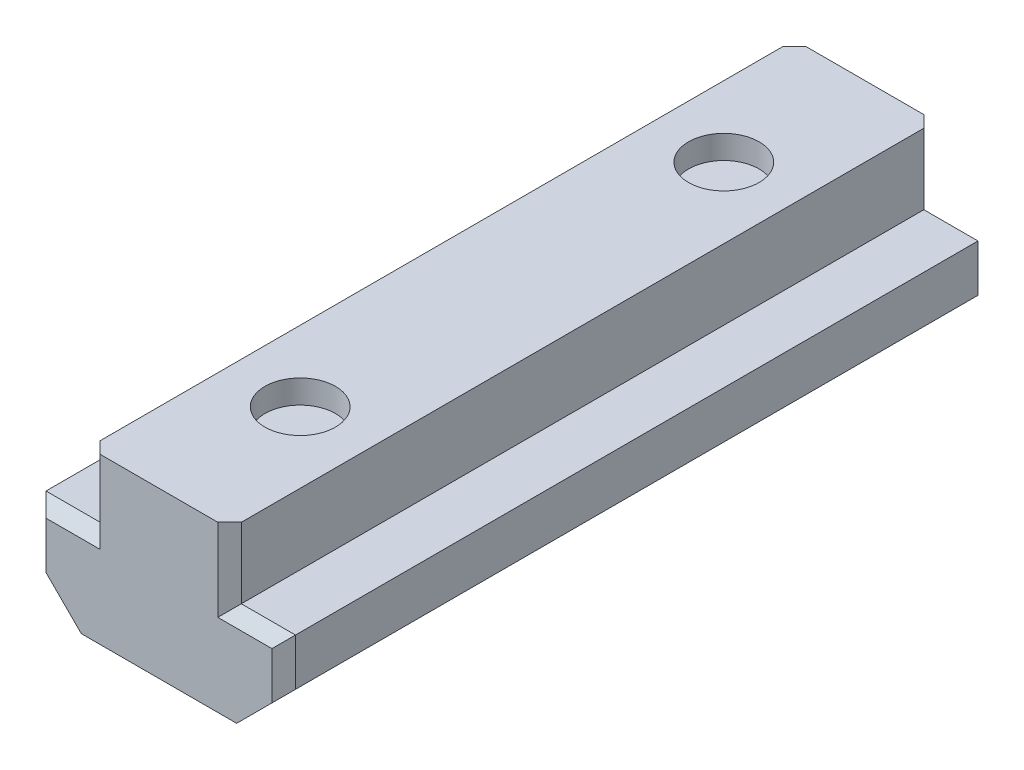
ISO-10303-21;
HEADER;
FILE_DESCRIPTION(('STEP AP214'),'2;1');
FILE_NAME('part.step','',(''),(''),'','','');
FILE_SCHEMA(('AUTOMOTIVE_DESIGN { 1 0 10303 214 1 1 1 1 }'));
ENDSEC;
DATA;
#1=APPLICATION_CONTEXT('core data for automotive mechanical design processes');
#2=APPLICATION_PROTOCOL_DEFINITION('international standard','automotive_design',2000,#1);
#3=PRODUCT_CONTEXT('',#1,'mechanical');
#4=PRODUCT('Part','Part','',(#3));
#5=PRODUCT_RELATED_PRODUCT_CATEGORY('part','',(#4));
#6=PRODUCT_DEFINITION_FORMATION('','',#4);
#7=PRODUCT_DEFINITION_CONTEXT('part definition',#1,'design');
#8=PRODUCT_DEFINITION('design','',#6,#7);
#9=PRODUCT_DEFINITION_SHAPE('','',#8);
#10=(LENGTH_UNIT() NAMED_UNIT(*) SI_UNIT(.MILLI.,.METRE.));
#11=(NAMED_UNIT(*) PLANE_ANGLE_UNIT() SI_UNIT($,.RADIAN.));
#12=(NAMED_UNIT(*) SI_UNIT($,.STERADIAN.) SOLID_ANGLE_UNIT());
#13=UNCERTAINTY_MEASURE_WITH_UNIT(LENGTH_MEASURE(1.E-05),#10,'distance_accuracy_value','');
#14=(GEOMETRIC_REPRESENTATION_CONTEXT(3) GLOBAL_UNCERTAINTY_ASSIGNED_CONTEXT((#13)) GLOBAL_UNIT_ASSIGNED_CONTEXT((#10,
#11,#12)) REPRESENTATION_CONTEXT('',''));
#15=CARTESIAN_POINT('',(0.,0.,0.));
#16=DIRECTION('',(0.,0.,1.));
#17=DIRECTION('',(1.,0.,0.));
#18=AXIS2_PLACEMENT_3D('',#15,#16,#17);
#19=CARTESIAN_POINT('',(-3.,0.,15.));
#20=DIRECTION('',(0.,-1.,0.));
#21=DIRECTION('',(0.,0.,-1.));
#22=AXIS2_PLACEMENT_3D('',#19,#20,#21);
#23=PLANE('',#22);
#24=CARTESIAN_POINT('',(0.,0.,-9.));
#25=DIRECTION('',(0.,1.,0.));
#26=DIRECTION('',(0.,0.,1.));
#27=AXIS2_PLACEMENT_3D('',#24,#25,#26);
#28=CIRCLE('',#27,1.5);
#29=CARTESIAN_POINT('',(0.,0.,-7.5));
#30=VERTEX_POINT('',#29);
#31=EDGE_CURVE('E385',#30,#30,#28,.T.);
#32=ORIENTED_EDGE('',*,*,#31,.F.);
#33=EDGE_LOOP('',(#32));
#34=FACE_BOUND('',#33,.T.);
#35=CARTESIAN_POINT('',(0.,0.,9.));
#36=DIRECTION('',(0.,1.,0.));
#37=DIRECTION('',(0.,0.,-1.));
#38=AXIS2_PLACEMENT_3D('',#35,#36,#37);
#39=CIRCLE('',#38,1.5);
#40=CARTESIAN_POINT('',(0.,0.,7.5));
#41=VERTEX_POINT('',#40);
#42=EDGE_CURVE('E382',#41,#41,#39,.T.);
#43=ORIENTED_EDGE('',*,*,#42,.F.);
#44=EDGE_LOOP('',(#43));
#45=FACE_BOUND('',#44,.T.);
#46=DIRECTION('',(-0.707106781186545,0.,0.70710678118655));
#47=VECTOR('',#46,1.);
#48=CARTESIAN_POINT('',(-2.5,0.,-15.));
#49=LINE('',#48,#47);
#50=CARTESIAN_POINT('',(-3.,0.,-14.5));
#51=VERTEX_POINT('',#50);
#52=CARTESIAN_POINT('',(-2.5,0.,-15.));
#53=VERTEX_POINT('',#52);
#54=EDGE_CURVE('E173',#51,#53,#49,.F.);
#55=ORIENTED_EDGE('',*,*,#54,.F.);
#56=DIRECTION('',(0.,0.,-1.));
#57=VECTOR('',#56,1.);
#58=CARTESIAN_POINT('',(-3.,0.,15.));
#59=LINE('',#58,#57);
#60=CARTESIAN_POINT('',(-3.,0.,14.5));
#61=VERTEX_POINT('',#60);
#62=EDGE_CURVE('E185',#61,#51,#59,.T.);
#63=ORIENTED_EDGE('',*,*,#62,.F.);
#64=DIRECTION('',(-0.707106781186545,0.,-0.70710678118655));
#65=VECTOR('',#64,1.);
#66=CARTESIAN_POINT('',(-2.5,0.,15.));
#67=LINE('',#66,#65);
#68=CARTESIAN_POINT('',(-2.5,0.,15.));
#69=VERTEX_POINT('',#68);
#70=EDGE_CURVE('E244',#61,#69,#67,.F.);
#71=ORIENTED_EDGE('',*,*,#70,.T.);
#72=DIRECTION('',(-1.,0.,0.));
#73=VECTOR('',#72,1.);
#74=CARTESIAN_POINT('',(-3.,0.,15.));
#75=LINE('',#74,#73);
#76=CARTESIAN_POINT('',(2.5,0.,15.));
#77=VERTEX_POINT('',#76);
#78=EDGE_CURVE('E278',#77,#69,#75,.T.);
#79=ORIENTED_EDGE('',*,*,#78,.F.);
#80=DIRECTION('',(-0.707106781186545,0.,0.70710678118655));
#81=VECTOR('',#80,1.);
#82=CARTESIAN_POINT('',(2.5,0.,15.));
#83=LINE('',#82,#81);
#84=CARTESIAN_POINT('',(3.,0.,14.5));
#85=VERTEX_POINT('',#84);
#86=EDGE_CURVE('E242',#77,#85,#83,.F.);
#87=ORIENTED_EDGE('',*,*,#86,.T.);
#88=DIRECTION('',(0.,0.,-1.));
#89=VECTOR('',#88,1.);
#90=CARTESIAN_POINT('',(3.,0.,15.));
#91=LINE('',#90,#89);
#92=CARTESIAN_POINT('',(3.,0.,-14.5));
#93=VERTEX_POINT('',#92);
#94=EDGE_CURVE('E195',#85,#93,#91,.T.);
#95=ORIENTED_EDGE('',*,*,#94,.T.);
#96=DIRECTION('',(-0.707106781186545,0.,-0.70710678118655));
#97=VECTOR('',#96,1.);
#98=CARTESIAN_POINT('',(2.5,0.,-15.));
#99=LINE('',#98,#97);
#100=CARTESIAN_POINT('',(2.5,0.,-15.));
#101=VERTEX_POINT('',#100);
#102=EDGE_CURVE('E332',#101,#93,#99,.F.);
#103=ORIENTED_EDGE('',*,*,#102,.F.);
#104=DIRECTION('',(-1.,0.,0.));
#105=VECTOR('',#104,1.);
#106=CARTESIAN_POINT('',(-3.,0.,-15.));
#107=LINE('',#106,#105);
#108=EDGE_CURVE('E189',#101,#53,#107,.T.);
#109=ORIENTED_EDGE('',*,*,#108,.T.);
#110=EDGE_LOOP('',(#55,#63,#71,#79,#87,#95,#103,#109));
#111=FACE_BOUND('',#110,.T.);
#112=ADVANCED_FACE('F43',(#34,#45,#111),#23,.F.);
#113=CARTESIAN_POINT('',(0.,0.,-15.));
#114=DIRECTION('',(0.,0.,-1.));
#115=DIRECTION('',(-1.,0.,0.));
#116=AXIS2_PLACEMENT_3D('',#113,#114,#115);
#117=PLANE('',#116);
#118=DIRECTION('',(0.707106781186546,-0.707106781186549,0.));
#119=VECTOR('',#118,1.);
#120=CARTESIAN_POINT('',(-5.15000000000001,-5.14999999999999,-15.));
#121=LINE('',#120,#119);
#122=CARTESIAN_POINT('',(-3.30000000000001,-7.,-15.));
#123=VERTEX_POINT('',#122);
#124=CARTESIAN_POINT('',(-4.80000000000001,-5.49999999999999,-15.));
#125=VERTEX_POINT('',#124);
#126=EDGE_CURVE('E210',#123,#125,#121,.F.);
#127=ORIENTED_EDGE('',*,*,#126,.T.);
#128=DIRECTION('',(0.,-1.,0.));
#129=VECTOR('',#128,1.);
#130=CARTESIAN_POINT('',(-4.8,0.,-15.));
#131=LINE('',#130,#129);
#132=CARTESIAN_POINT('',(-4.8,-3.5,-15.));
#133=VERTEX_POINT('',#132);
#134=EDGE_CURVE('E61',#133,#125,#131,.T.);
#135=ORIENTED_EDGE('',*,*,#134,.F.);
#136=DIRECTION('',(-1.,0.,0.));
#137=VECTOR('',#136,1.);
#138=CARTESIAN_POINT('',(0.,-3.5,-15.));
#139=LINE('',#138,#137);
#140=CARTESIAN_POINT('',(-2.5,-3.5,-15.));
#141=VERTEX_POINT('',#140);
#142=EDGE_CURVE('E368',#141,#133,#139,.T.);
#143=ORIENTED_EDGE('',*,*,#142,.F.);
#144=DIRECTION('',(0.,-1.,0.));
#145=VECTOR('',#144,1.);
#146=CARTESIAN_POINT('',(-2.5,0.,-15.));
#147=LINE('',#146,#145);
#148=EDGE_CURVE('E376',#53,#141,#147,.T.);
#149=ORIENTED_EDGE('',*,*,#148,.F.);
#150=ORIENTED_EDGE('',*,*,#108,.F.);
#151=DIRECTION('',(0.,1.,0.));
#152=VECTOR('',#151,1.);
#153=CARTESIAN_POINT('',(2.5,0.,-15.));
#154=LINE('',#153,#152);
#155=CARTESIAN_POINT('',(2.5,-3.5,-15.));
#156=VERTEX_POINT('',#155);
#157=EDGE_CURVE('E338',#156,#101,#154,.T.);
#158=ORIENTED_EDGE('',*,*,#157,.F.);
#159=DIRECTION('',(-1.,0.,0.));
#160=VECTOR('',#159,1.);
#161=CARTESIAN_POINT('',(0.,-3.5,-15.));
#162=LINE('',#161,#160);
#163=CARTESIAN_POINT('',(4.8,-3.5,-15.));
#164=VERTEX_POINT('',#163);
#165=EDGE_CURVE('E345',#164,#156,#162,.T.);
#166=ORIENTED_EDGE('',*,*,#165,.F.);
#167=DIRECTION('',(0.,1.,0.));
#168=VECTOR('',#167,1.);
#169=CARTESIAN_POINT('',(4.8,0.,-15.));
#170=LINE('',#169,#168);
#171=CARTESIAN_POINT('',(4.8,-5.5,-15.));
#172=VERTEX_POINT('',#171);
#173=EDGE_CURVE('E264',#172,#164,#170,.T.);
#174=ORIENTED_EDGE('',*,*,#173,.F.);
#175=DIRECTION('',(0.707106781186549,0.707106781186546,0.));
#176=VECTOR('',#175,1.);
#177=CARTESIAN_POINT('',(5.14999999999999,-5.15000000000001,-15.));
#178=LINE('',#177,#176);
#179=CARTESIAN_POINT('',(3.29999999999999,-7.,-15.));
#180=VERTEX_POINT('',#179);
#181=EDGE_CURVE('E213',#172,#180,#178,.F.);
#182=ORIENTED_EDGE('',*,*,#181,.T.);
#183=DIRECTION('',(1.,0.,0.));
#184=VECTOR('',#183,1.);
#185=CARTESIAN_POINT('',(5.3,-7.,-15.));
#186=LINE('',#185,#184);
#187=EDGE_CURVE('E282',#123,#180,#186,.T.);
#188=ORIENTED_EDGE('',*,*,#187,.F.);
#189=EDGE_LOOP('',(#127,#135,#143,#149,#150,#158,#166,#174,#182,#188));
#190=FACE_BOUND('',#189,.T.);
#191=ADVANCED_FACE('F352',(#190),#117,.T.);
#192=CARTESIAN_POINT('',(-3.,0.,15.));
#193=DIRECTION('',(1.,0.,0.));
#194=DIRECTION('',(0.,1.,0.));
#195=AXIS2_PLACEMENT_3D('',#192,#193,#194);
#196=PLANE('',#195);
#197=DIRECTION('',(0.,1.,0.));
#198=VECTOR('',#197,1.);
#199=CARTESIAN_POINT('',(-3.,0.,-14.5));
#200=LINE('',#199,#198);
#201=CARTESIAN_POINT('',(-3.,-3.,-14.5));
#202=VERTEX_POINT('',#201);
#203=EDGE_CURVE('E169',#202,#51,#200,.T.);
#204=ORIENTED_EDGE('',*,*,#203,.F.);
#205=DIRECTION('',(0.,0.,-1.));
#206=VECTOR('',#205,1.);
#207=CARTESIAN_POINT('',(-3.,-3.,15.));
#208=LINE('',#207,#206);
#209=CARTESIAN_POINT('',(-3.,-3.,14.5));
#210=VERTEX_POINT('',#209);
#211=EDGE_CURVE('E196',#210,#202,#208,.T.);
#212=ORIENTED_EDGE('',*,*,#211,.F.);
#213=DIRECTION('',(0.,1.,0.));
#214=VECTOR('',#213,1.);
#215=CARTESIAN_POINT('',(-3.,0.,14.5));
#216=LINE('',#215,#214);
#217=EDGE_CURVE('E194',#210,#61,#216,.T.);
#218=ORIENTED_EDGE('',*,*,#217,.T.);
#219=ORIENTED_EDGE('',*,*,#62,.T.);
#220=EDGE_LOOP('',(#204,#212,#218,#219));
#221=FACE_BOUND('',#220,.T.);
#222=ADVANCED_FACE('F192',(#221),#196,.F.);
#223=CARTESIAN_POINT('',(-3.,-3.,15.));
#224=DIRECTION('',(0.,-1.,0.));
#225=DIRECTION('',(0.,0.,-1.));
#226=AXIS2_PLACEMENT_3D('',#223,#224,#225);
#227=PLANE('',#226);
#228=DIRECTION('',(1.,0.,0.));
#229=VECTOR('',#228,1.);
#230=CARTESIAN_POINT('',(-3.,-3.,-14.5));
#231=LINE('',#230,#229);
#232=CARTESIAN_POINT('',(-5.3,-3.,-14.5));
#233=VERTEX_POINT('',#232);
#234=EDGE_CURVE('E304',#233,#202,#231,.T.);
#235=ORIENTED_EDGE('',*,*,#234,.F.);
#236=DIRECTION('',(0.,0.,-1.));
#237=VECTOR('',#236,1.);
#238=CARTESIAN_POINT('',(-5.3,-3.,15.));
#239=LINE('',#238,#237);
#240=CARTESIAN_POINT('',(-5.3,-3.,14.5));
#241=VERTEX_POINT('',#240);
#242=EDGE_CURVE('E201',#241,#233,#239,.T.);
#243=ORIENTED_EDGE('',*,*,#242,.F.);
#244=DIRECTION('',(1.,0.,0.));
#245=VECTOR('',#244,1.);
#246=CARTESIAN_POINT('',(-3.,-3.,14.5));
#247=LINE('',#246,#245);
#248=EDGE_CURVE('E246',#241,#210,#247,.T.);
#249=ORIENTED_EDGE('',*,*,#248,.T.);
#250=ORIENTED_EDGE('',*,*,#211,.T.);
#251=EDGE_LOOP('',(#235,#243,#249,#250));
#252=FACE_BOUND('',#251,.T.);
#253=ADVANCED_FACE('F302',(#252),#227,.F.);
#254=CARTESIAN_POINT('',(-5.3,-3.,15.));
#255=DIRECTION('',(1.,0.,0.));
#256=DIRECTION('',(0.,1.,0.));
#257=AXIS2_PLACEMENT_3D('',#254,#255,#256);
#258=PLANE('',#257);
#259=DIRECTION('',(0.,1.,0.));
#260=VECTOR('',#259,1.);
#261=CARTESIAN_POINT('',(-5.3,-3.,-14.5));
#262=LINE('',#261,#260);
#263=CARTESIAN_POINT('',(-5.3,-5.,-14.5));
#264=VERTEX_POINT('',#263);
#265=EDGE_CURVE('E296',#264,#233,#262,.T.);
#266=ORIENTED_EDGE('',*,*,#265,.F.);
#267=DIRECTION('',(0.,0.,1.));
#268=VECTOR('',#267,1.);
#269=CARTESIAN_POINT('',(-5.3,-5.,15.));
#270=LINE('',#269,#268);
#271=CARTESIAN_POINT('',(-5.3,-5.,14.5));
#272=VERTEX_POINT('',#271);
#273=EDGE_CURVE('E225',#264,#272,#270,.T.);
#274=ORIENTED_EDGE('',*,*,#273,.T.);
#275=DIRECTION('',(0.,1.,0.));
#276=VECTOR('',#275,1.);
#277=CARTESIAN_POINT('',(-5.3,-3.,14.5));
#278=LINE('',#277,#276);
#279=EDGE_CURVE('E251',#272,#241,#278,.T.);
#280=ORIENTED_EDGE('',*,*,#279,.T.);
#281=ORIENTED_EDGE('',*,*,#242,.T.);
#282=EDGE_LOOP('',(#266,#274,#280,#281));
#283=FACE_BOUND('',#282,.T.);
#284=ADVANCED_FACE('F294',(#283),#258,.F.);
#285=CARTESIAN_POINT('',(-3.30000000000001,-7.,15.));
#286=DIRECTION('',(0.707106781186549,0.707106781186546,0.));
#287=DIRECTION('',(0.,0.,-1.));
#288=AXIS2_PLACEMENT_3D('',#285,#286,#287);
#289=PLANE('',#288);
#290=ORIENTED_EDGE('',*,*,#273,.F.);
#291=DIRECTION('',(-0.577350269189624,0.577350269189626,0.577350269189628));
#292=VECTOR('',#291,1.);
#293=CARTESIAN_POINT('',(-3.80000000000001,-6.5,-16.));
#294=LINE('',#293,#292);
#295=EDGE_CURVE('E369',#125,#264,#294,.T.);
#296=ORIENTED_EDGE('',*,*,#295,.F.);
#297=ORIENTED_EDGE('',*,*,#126,.F.);
#298=DIRECTION('',(0.,0.,-1.));
#299=VECTOR('',#298,1.);
#300=CARTESIAN_POINT('',(-3.30000000000001,-7.,15.));
#301=LINE('',#300,#299);
#302=CARTESIAN_POINT('',(-3.30000000000001,-7.,15.));
#303=VERTEX_POINT('',#302);
#304=EDGE_CURVE('E215',#303,#123,#301,.T.);
#305=ORIENTED_EDGE('',*,*,#304,.F.);
#306=DIRECTION('',(-0.707106781186546,0.707106781186549,0.));
#307=VECTOR('',#306,1.);
#308=CARTESIAN_POINT('',(-3.30000000000001,-7.,15.));
#309=LINE('',#308,#307);
#310=CARTESIAN_POINT('',(-4.8,-5.5,15.));
#311=VERTEX_POINT('',#310);
#312=EDGE_CURVE('E220',#311,#303,#309,.F.);
#313=ORIENTED_EDGE('',*,*,#312,.F.);
#314=DIRECTION('',(-0.577350269189624,0.577350269189626,-0.577350269189628));
#315=VECTOR('',#314,1.);
#316=CARTESIAN_POINT('',(-3.80000000000001,-6.5,16.));
#317=LINE('',#316,#315);
#318=EDGE_CURVE('E248',#311,#272,#317,.T.);
#319=ORIENTED_EDGE('',*,*,#318,.T.);
#320=EDGE_LOOP('',(#290,#296,#297,#305,#313,#319));
#321=FACE_BOUND('',#320,.T.);
#322=ADVANCED_FACE('F365',(#321),#289,.F.);
#323=CARTESIAN_POINT('',(3.,-3.,15.));
#324=DIRECTION('',(0.,-1.,0.));
#325=DIRECTION('',(0.,0.,-1.));
#326=AXIS2_PLACEMENT_3D('',#323,#324,#325);
#327=PLANE('',#326);
#328=DIRECTION('',(1.,0.,0.));
#329=VECTOR('',#328,1.);
#330=CARTESIAN_POINT('',(3.,-3.,-14.5));
#331=LINE('',#330,#329);
#332=CARTESIAN_POINT('',(3.,-3.,-14.5));
#333=VERTEX_POINT('',#332);
#334=CARTESIAN_POINT('',(5.3,-3.,-14.5));
#335=VERTEX_POINT('',#334);
#336=EDGE_CURVE('E342',#333,#335,#331,.T.);
#337=ORIENTED_EDGE('',*,*,#336,.F.);
#338=DIRECTION('',(0.,0.,-1.));
#339=VECTOR('',#338,1.);
#340=CARTESIAN_POINT('',(3.,-3.,15.));
#341=LINE('',#340,#339);
#342=CARTESIAN_POINT('',(3.,-3.,14.5));
#343=VERTEX_POINT('',#342);
#344=EDGE_CURVE('E199',#343,#333,#341,.T.);
#345=ORIENTED_EDGE('',*,*,#344,.F.);
#346=DIRECTION('',(1.,0.,0.));
#347=VECTOR('',#346,1.);
#348=CARTESIAN_POINT('',(3.,-3.,14.5));
#349=LINE('',#348,#347);
#350=CARTESIAN_POINT('',(5.3,-3.,14.5));
#351=VERTEX_POINT('',#350);
#352=EDGE_CURVE('E255',#343,#351,#349,.T.);
#353=ORIENTED_EDGE('',*,*,#352,.T.);
#354=DIRECTION('',(0.,0.,-1.));
#355=VECTOR('',#354,1.);
#356=CARTESIAN_POINT('',(5.3,-3.,15.));
#357=LINE('',#356,#355);
#358=EDGE_CURVE('E285',#351,#335,#357,.T.);
#359=ORIENTED_EDGE('',*,*,#358,.T.);
#360=EDGE_LOOP('',(#337,#345,#353,#359));
#361=FACE_BOUND('',#360,.T.);
#362=ADVANCED_FACE('F453',(#361),#327,.F.);
#363=CARTESIAN_POINT('',(3.,0.,15.));
#364=DIRECTION('',(-1.,0.,0.));
#365=DIRECTION('',(0.,-1.,0.));
#366=AXIS2_PLACEMENT_3D('',#363,#364,#365);
#367=PLANE('',#366);
#368=DIRECTION('',(0.,-1.,0.));
#369=VECTOR('',#368,1.);
#370=CARTESIAN_POINT('',(3.,0.,-14.5));
#371=LINE('',#370,#369);
#372=EDGE_CURVE('E327',#93,#333,#371,.T.);
#373=ORIENTED_EDGE('',*,*,#372,.F.);
#374=ORIENTED_EDGE('',*,*,#94,.F.);
#375=DIRECTION('',(0.,-1.,0.));
#376=VECTOR('',#375,1.);
#377=CARTESIAN_POINT('',(3.,0.,14.5));
#378=LINE('',#377,#376);
#379=EDGE_CURVE('E253',#85,#343,#378,.T.);
#380=ORIENTED_EDGE('',*,*,#379,.T.);
#381=ORIENTED_EDGE('',*,*,#344,.T.);
#382=EDGE_LOOP('',(#373,#374,#380,#381));
#383=FACE_BOUND('',#382,.T.);
#384=ADVANCED_FACE('F324',(#383),#367,.F.);
#385=CARTESIAN_POINT('',(5.3,-3.,15.));
#386=DIRECTION('',(-1.,0.,0.));
#387=DIRECTION('',(0.,-1.,0.));
#388=AXIS2_PLACEMENT_3D('',#385,#386,#387);
#389=PLANE('',#388);
#390=DIRECTION('',(0.,-1.,0.));
#391=VECTOR('',#390,1.);
#392=CARTESIAN_POINT('',(5.3,-3.,-14.5));
#393=LINE('',#392,#391);
#394=CARTESIAN_POINT('',(5.3,-5.,-14.5));
#395=VERTEX_POINT('',#394);
#396=EDGE_CURVE('E69',#335,#395,#393,.T.);
#397=ORIENTED_EDGE('',*,*,#396,.F.);
#398=ORIENTED_EDGE('',*,*,#358,.F.);
#399=DIRECTION('',(0.,-1.,0.));
#400=VECTOR('',#399,1.);
#401=CARTESIAN_POINT('',(5.3,-3.,14.5));
#402=LINE('',#401,#400);
#403=CARTESIAN_POINT('',(5.3,-5.,14.5));
#404=VERTEX_POINT('',#403);
#405=EDGE_CURVE('E53',#351,#404,#402,.T.);
#406=ORIENTED_EDGE('',*,*,#405,.T.);
#407=DIRECTION('',(0.,0.,-1.));
#408=VECTOR('',#407,1.);
#409=CARTESIAN_POINT('',(5.3,-5.,15.));
#410=LINE('',#409,#408);
#411=EDGE_CURVE('E207',#404,#395,#410,.T.);
#412=ORIENTED_EDGE('',*,*,#411,.T.);
#413=EDGE_LOOP('',(#397,#398,#406,#412));
#414=FACE_BOUND('',#413,.T.);
#415=ADVANCED_FACE('F439',(#414),#389,.F.);
#416=CARTESIAN_POINT('',(5.3,-5.,15.));
#417=DIRECTION('',(-0.707106781186546,0.707106781186549,0.));
#418=DIRECTION('',(0.,0.,-1.));
#419=AXIS2_PLACEMENT_3D('',#416,#417,#418);
#420=PLANE('',#419);
#421=ORIENTED_EDGE('',*,*,#181,.F.);
#422=DIRECTION('',(-0.577350269189625,-0.577350269189623,-0.577350269189629));
#423=VECTOR('',#422,1.);
#424=CARTESIAN_POINT('',(5.13333333333333,-5.16666666666667,-14.6666666666667));
#425=LINE('',#424,#423);
#426=EDGE_CURVE('E274',#395,#172,#425,.T.);
#427=ORIENTED_EDGE('',*,*,#426,.F.);
#428=ORIENTED_EDGE('',*,*,#411,.F.);
#429=DIRECTION('',(-0.577350269189625,-0.577350269189623,0.577350269189629));
#430=VECTOR('',#429,1.);
#431=CARTESIAN_POINT('',(5.13333333333333,-5.16666666666667,14.6666666666667));
#432=LINE('',#431,#430);
#433=CARTESIAN_POINT('',(4.8,-5.5,15.));
#434=VERTEX_POINT('',#433);
#435=EDGE_CURVE('E11',#404,#434,#432,.T.);
#436=ORIENTED_EDGE('',*,*,#435,.T.);
#437=DIRECTION('',(-0.707106781186549,-0.707106781186546,0.));
#438=VECTOR('',#437,1.);
#439=CARTESIAN_POINT('',(5.3,-5.,15.));
#440=LINE('',#439,#438);
#441=CARTESIAN_POINT('',(3.29999999999999,-7.,15.));
#442=VERTEX_POINT('',#441);
#443=EDGE_CURVE('E222',#442,#434,#440,.F.);
#444=ORIENTED_EDGE('',*,*,#443,.F.);
#445=DIRECTION('',(0.,0.,1.));
#446=VECTOR('',#445,1.);
#447=CARTESIAN_POINT('',(3.29999999999999,-7.,15.));
#448=LINE('',#447,#446);
#449=EDGE_CURVE('E218',#180,#442,#448,.T.);
#450=ORIENTED_EDGE('',*,*,#449,.F.);
#451=EDGE_LOOP('',(#421,#427,#428,#436,#444,#450));
#452=FACE_BOUND('',#451,.T.);
#453=ADVANCED_FACE('F356',(#452),#420,.F.);
#454=CARTESIAN_POINT('',(5.3,-7.,15.));
#455=DIRECTION('',(0.,1.,0.));
#456=DIRECTION('',(0.,0.,1.));
#457=AXIS2_PLACEMENT_3D('',#454,#455,#456);
#458=PLANE('',#457);
#459=ORIENTED_EDGE('',*,*,#187,.T.);
#460=ORIENTED_EDGE('',*,*,#449,.T.);
#461=DIRECTION('',(1.,0.,0.));
#462=VECTOR('',#461,1.);
#463=CARTESIAN_POINT('',(5.3,-7.,15.));
#464=LINE('',#463,#462);
#465=EDGE_CURVE('E281',#303,#442,#464,.T.);
#466=ORIENTED_EDGE('',*,*,#465,.F.);
#467=ORIENTED_EDGE('',*,*,#304,.T.);
#468=EDGE_LOOP('',(#459,#460,#466,#467));
#469=FACE_BOUND('',#468,.T.);
#470=ADVANCED_FACE('F360',(#469),#458,.F.);
#471=CARTESIAN_POINT('',(0.,0.,15.));
#472=DIRECTION('',(0.,0.,-1.));
#473=DIRECTION('',(-1.,0.,0.));
#474=AXIS2_PLACEMENT_3D('',#471,#472,#473);
#475=PLANE('',#474);
#476=ORIENTED_EDGE('',*,*,#78,.T.);
#477=DIRECTION('',(0.,-1.,0.));
#478=VECTOR('',#477,1.);
#479=CARTESIAN_POINT('',(-2.5,0.,15.));
#480=LINE('',#479,#478);
#481=CARTESIAN_POINT('',(-2.5,-3.5,15.));
#482=VERTEX_POINT('',#481);
#483=EDGE_CURVE('E238',#69,#482,#480,.T.);
#484=ORIENTED_EDGE('',*,*,#483,.T.);
#485=DIRECTION('',(-1.,0.,0.));
#486=VECTOR('',#485,1.);
#487=CARTESIAN_POINT('',(0.,-3.5,15.));
#488=LINE('',#487,#486);
#489=CARTESIAN_POINT('',(-4.8,-3.5,15.));
#490=VERTEX_POINT('',#489);
#491=EDGE_CURVE('E236',#482,#490,#488,.T.);
#492=ORIENTED_EDGE('',*,*,#491,.T.);
#493=DIRECTION('',(0.,-1.,0.));
#494=VECTOR('',#493,1.);
#495=CARTESIAN_POINT('',(-4.8,0.,15.));
#496=LINE('',#495,#494);
#497=EDGE_CURVE('E234',#490,#311,#496,.T.);
#498=ORIENTED_EDGE('',*,*,#497,.T.);
#499=ORIENTED_EDGE('',*,*,#312,.T.);
#500=ORIENTED_EDGE('',*,*,#465,.T.);
#501=ORIENTED_EDGE('',*,*,#443,.T.);
#502=DIRECTION('',(0.,1.,0.));
#503=VECTOR('',#502,1.);
#504=CARTESIAN_POINT('',(4.8,0.,15.));
#505=LINE('',#504,#503);
#506=CARTESIAN_POINT('',(4.8,-3.5,15.));
#507=VERTEX_POINT('',#506);
#508=EDGE_CURVE('E227',#434,#507,#505,.T.);
#509=ORIENTED_EDGE('',*,*,#508,.T.);
#510=DIRECTION('',(-1.,0.,0.));
#511=VECTOR('',#510,1.);
#512=CARTESIAN_POINT('',(0.,-3.5,15.));
#513=LINE('',#512,#511);
#514=CARTESIAN_POINT('',(2.5,-3.5,15.));
#515=VERTEX_POINT('',#514);
#516=EDGE_CURVE('E229',#507,#515,#513,.T.);
#517=ORIENTED_EDGE('',*,*,#516,.T.);
#518=DIRECTION('',(0.,1.,0.));
#519=VECTOR('',#518,1.);
#520=CARTESIAN_POINT('',(2.5,0.,15.));
#521=LINE('',#520,#519);
#522=EDGE_CURVE('E231',#515,#77,#521,.T.);
#523=ORIENTED_EDGE('',*,*,#522,.T.);
#524=EDGE_LOOP('',(#476,#484,#492,#498,#499,#500,#501,#509,#517,#523));
#525=FACE_BOUND('',#524,.T.);
#526=ADVANCED_FACE('F318',(#525),#475,.F.);
#527=CARTESIAN_POINT('',(-4.8,0.,15.));
#528=DIRECTION('',(0.70710678118655,0.,-0.707106781186545));
#529=DIRECTION('',(0.,-1.,0.));
#530=AXIS2_PLACEMENT_3D('',#527,#528,#529);
#531=PLANE('',#530);
#532=ORIENTED_EDGE('',*,*,#318,.F.);
#533=ORIENTED_EDGE('',*,*,#497,.F.);
#534=DIRECTION('',(-0.577350269189624,0.577350269189624,-0.577350269189628));
#535=VECTOR('',#534,1.);
#536=CARTESIAN_POINT('',(-5.96666666666666,-2.33333333333334,13.8333333333333));
#537=LINE('',#536,#535);
#538=EDGE_CURVE('E260',#241,#490,#537,.F.);
#539=ORIENTED_EDGE('',*,*,#538,.F.);
#540=ORIENTED_EDGE('',*,*,#279,.F.);
#541=EDGE_LOOP('',(#532,#533,#539,#540));
#542=FACE_BOUND('',#541,.T.);
#543=ADVANCED_FACE('F308',(#542),#531,.F.);
#544=CARTESIAN_POINT('',(0.,-3.5,15.));
#545=DIRECTION('',(0.,-0.70710678118655,-0.707106781186545));
#546=DIRECTION('',(-1.,0.,0.));
#547=AXIS2_PLACEMENT_3D('',#544,#545,#546);
#548=PLANE('',#547);
#549=ORIENTED_EDGE('',*,*,#538,.T.);
#550=ORIENTED_EDGE('',*,*,#491,.F.);
#551=DIRECTION('',(-0.577350269189624,0.577350269189625,-0.577350269189629));
#552=VECTOR('',#551,1.);
#553=CARTESIAN_POINT('',(-3.66666666666666,-2.33333333333334,13.8333333333333));
#554=LINE('',#553,#552);
#555=EDGE_CURVE('E258',#210,#482,#554,.F.);
#556=ORIENTED_EDGE('',*,*,#555,.F.);
#557=ORIENTED_EDGE('',*,*,#248,.F.);
#558=EDGE_LOOP('',(#549,#550,#556,#557));
#559=FACE_BOUND('',#558,.T.);
#560=ADVANCED_FACE('F312',(#559),#548,.F.);
#561=CARTESIAN_POINT('',(-2.5,0.,15.));
#562=DIRECTION('',(0.70710678118655,0.,-0.707106781186545));
#563=DIRECTION('',(0.,-1.,0.));
#564=AXIS2_PLACEMENT_3D('',#561,#562,#563);
#565=PLANE('',#564);
#566=ORIENTED_EDGE('',*,*,#70,.F.);
#567=ORIENTED_EDGE('',*,*,#217,.F.);
#568=ORIENTED_EDGE('',*,*,#555,.T.);
#569=ORIENTED_EDGE('',*,*,#483,.F.);
#570=EDGE_LOOP('',(#566,#567,#568,#569));
#571=FACE_BOUND('',#570,.T.);
#572=ADVANCED_FACE('F315',(#571),#565,.F.);
#573=CARTESIAN_POINT('',(4.8,0.,15.));
#574=DIRECTION('',(-0.70710678118655,0.,-0.707106781186545));
#575=DIRECTION('',(0.,1.,0.));
#576=AXIS2_PLACEMENT_3D('',#573,#574,#575);
#577=PLANE('',#576);
#578=ORIENTED_EDGE('',*,*,#435,.F.);
#579=ORIENTED_EDGE('',*,*,#405,.F.);
#580=DIRECTION('',(-0.577350269189624,-0.577350269189624,0.577350269189628));
#581=VECTOR('',#580,1.);
#582=CARTESIAN_POINT('',(5.96666666666666,-2.33333333333334,13.8333333333333));
#583=LINE('',#582,#581);
#584=EDGE_CURVE('E48',#507,#351,#583,.F.);
#585=ORIENTED_EDGE('',*,*,#584,.F.);
#586=ORIENTED_EDGE('',*,*,#508,.F.);
#587=EDGE_LOOP('',(#578,#579,#585,#586));
#588=FACE_BOUND('',#587,.T.);
#589=ADVANCED_FACE('F46',(#588),#577,.F.);
#590=CARTESIAN_POINT('',(0.,-3.5,15.));
#591=DIRECTION('',(0.,-0.70710678118655,-0.707106781186545));
#592=DIRECTION('',(-1.,0.,0.));
#593=AXIS2_PLACEMENT_3D('',#590,#591,#592);
#594=PLANE('',#593);
#595=ORIENTED_EDGE('',*,*,#584,.T.);
#596=ORIENTED_EDGE('',*,*,#352,.F.);
#597=DIRECTION('',(-0.577350269189624,-0.577350269189625,0.577350269189629));
#598=VECTOR('',#597,1.);
#599=CARTESIAN_POINT('',(3.66666666666666,-2.33333333333334,13.8333333333333));
#600=LINE('',#599,#598);
#601=EDGE_CURVE('E262',#515,#343,#600,.F.);
#602=ORIENTED_EDGE('',*,*,#601,.F.);
#603=ORIENTED_EDGE('',*,*,#516,.F.);
#604=EDGE_LOOP('',(#595,#596,#602,#603));
#605=FACE_BOUND('',#604,.T.);
#606=ADVANCED_FACE('F487',(#605),#594,.F.);
#607=CARTESIAN_POINT('',(2.5,0.,15.));
#608=DIRECTION('',(-0.70710678118655,0.,-0.707106781186545));
#609=DIRECTION('',(0.,1.,0.));
#610=AXIS2_PLACEMENT_3D('',#607,#608,#609);
#611=PLANE('',#610);
#612=ORIENTED_EDGE('',*,*,#601,.T.);
#613=ORIENTED_EDGE('',*,*,#379,.F.);
#614=ORIENTED_EDGE('',*,*,#86,.F.);
#615=ORIENTED_EDGE('',*,*,#522,.F.);
#616=EDGE_LOOP('',(#612,#613,#614,#615));
#617=FACE_BOUND('',#616,.T.);
#618=ADVANCED_FACE('F320',(#617),#611,.F.);
#619=CARTESIAN_POINT('',(4.8,0.,-15.));
#620=DIRECTION('',(-0.70710678118655,0.,0.707106781186545));
#621=DIRECTION('',(0.,1.,0.));
#622=AXIS2_PLACEMENT_3D('',#619,#620,#621);
#623=PLANE('',#622);
#624=ORIENTED_EDGE('',*,*,#426,.T.);
#625=ORIENTED_EDGE('',*,*,#173,.T.);
#626=DIRECTION('',(-0.577350269189624,-0.577350269189624,-0.577350269189628));
#627=VECTOR('',#626,1.);
#628=CARTESIAN_POINT('',(5.96666666666666,-2.33333333333334,-13.8333333333333));
#629=LINE('',#628,#627);
#630=EDGE_CURVE('E340',#164,#335,#629,.F.);
#631=ORIENTED_EDGE('',*,*,#630,.T.);
#632=ORIENTED_EDGE('',*,*,#396,.T.);
#633=EDGE_LOOP('',(#624,#625,#631,#632));
#634=FACE_BOUND('',#633,.T.);
#635=ADVANCED_FACE('F347',(#634),#623,.F.);
#636=CARTESIAN_POINT('',(0.,-3.5,-15.));
#637=DIRECTION('',(0.,-0.70710678118655,0.707106781186545));
#638=DIRECTION('',(-1.,0.,0.));
#639=AXIS2_PLACEMENT_3D('',#636,#637,#638);
#640=PLANE('',#639);
#641=ORIENTED_EDGE('',*,*,#630,.F.);
#642=ORIENTED_EDGE('',*,*,#165,.T.);
#643=DIRECTION('',(-0.577350269189624,-0.577350269189625,-0.577350269189629));
#644=VECTOR('',#643,1.);
#645=CARTESIAN_POINT('',(3.66666666666666,-2.33333333333334,-13.8333333333333));
#646=LINE('',#645,#644);
#647=EDGE_CURVE('E330',#156,#333,#646,.F.);
#648=ORIENTED_EDGE('',*,*,#647,.T.);
#649=ORIENTED_EDGE('',*,*,#336,.T.);
#650=EDGE_LOOP('',(#641,#642,#648,#649));
#651=FACE_BOUND('',#650,.T.);
#652=ADVANCED_FACE('F429',(#651),#640,.F.);
#653=CARTESIAN_POINT('',(2.5,0.,-15.));
#654=DIRECTION('',(-0.70710678118655,0.,0.707106781186545));
#655=DIRECTION('',(0.,1.,0.));
#656=AXIS2_PLACEMENT_3D('',#653,#654,#655);
#657=PLANE('',#656);
#658=ORIENTED_EDGE('',*,*,#647,.F.);
#659=ORIENTED_EDGE('',*,*,#157,.T.);
#660=ORIENTED_EDGE('',*,*,#102,.T.);
#661=ORIENTED_EDGE('',*,*,#372,.T.);
#662=EDGE_LOOP('',(#658,#659,#660,#661));
#663=FACE_BOUND('',#662,.T.);
#664=ADVANCED_FACE('F426',(#663),#657,.F.);
#665=CARTESIAN_POINT('',(-4.8,0.,-15.));
#666=DIRECTION('',(0.70710678118655,0.,0.707106781186545));
#667=DIRECTION('',(0.,-1.,0.));
#668=AXIS2_PLACEMENT_3D('',#665,#666,#667);
#669=PLANE('',#668);
#670=ORIENTED_EDGE('',*,*,#295,.T.);
#671=ORIENTED_EDGE('',*,*,#265,.T.);
#672=DIRECTION('',(-0.577350269189624,0.577350269189624,0.577350269189628));
#673=VECTOR('',#672,1.);
#674=CARTESIAN_POINT('',(-5.96666666666666,-2.33333333333334,-13.8333333333333));
#675=LINE('',#674,#673);
#676=EDGE_CURVE('E374',#233,#133,#675,.F.);
#677=ORIENTED_EDGE('',*,*,#676,.T.);
#678=ORIENTED_EDGE('',*,*,#134,.T.);
#679=EDGE_LOOP('',(#670,#671,#677,#678));
#680=FACE_BOUND('',#679,.T.);
#681=ADVANCED_FACE('F422',(#680),#669,.F.);
#682=CARTESIAN_POINT('',(0.,-3.5,-15.));
#683=DIRECTION('',(0.,-0.70710678118655,0.707106781186545));
#684=DIRECTION('',(-1.,0.,0.));
#685=AXIS2_PLACEMENT_3D('',#682,#683,#684);
#686=PLANE('',#685);
#687=ORIENTED_EDGE('',*,*,#676,.F.);
#688=ORIENTED_EDGE('',*,*,#234,.T.);
#689=DIRECTION('',(-0.577350269189624,0.577350269189625,0.577350269189629));
#690=VECTOR('',#689,1.);
#691=CARTESIAN_POINT('',(-3.66666666666666,-2.33333333333334,-13.8333333333333));
#692=LINE('',#691,#690);
#693=EDGE_CURVE('E175',#202,#141,#692,.F.);
#694=ORIENTED_EDGE('',*,*,#693,.T.);
#695=ORIENTED_EDGE('',*,*,#142,.T.);
#696=EDGE_LOOP('',(#687,#688,#694,#695));
#697=FACE_BOUND('',#696,.T.);
#698=ADVANCED_FACE('F415',(#697),#686,.F.);
#699=CARTESIAN_POINT('',(-2.5,0.,-15.));
#700=DIRECTION('',(0.70710678118655,0.,0.707106781186545));
#701=DIRECTION('',(0.,-1.,0.));
#702=AXIS2_PLACEMENT_3D('',#699,#700,#701);
#703=PLANE('',#702);
#704=ORIENTED_EDGE('',*,*,#54,.T.);
#705=ORIENTED_EDGE('',*,*,#148,.T.);
#706=ORIENTED_EDGE('',*,*,#693,.F.);
#707=ORIENTED_EDGE('',*,*,#203,.T.);
#708=EDGE_LOOP('',(#704,#705,#706,#707));
#709=FACE_BOUND('',#708,.T.);
#710=ADVANCED_FACE('F171',(#709),#703,.F.);
#711=CARTESIAN_POINT('',(0.,-1.,9.));
#712=DIRECTION('',(0.,1.,0.));
#713=DIRECTION('',(0.,0.,1.));
#714=AXIS2_PLACEMENT_3D('',#711,#712,#713);
#715=CYLINDRICAL_SURFACE('',#714,1.5);
#716=CARTESIAN_POINT('',(0.,-1.,9.));
#717=DIRECTION('',(0.,1.,0.));
#718=DIRECTION('',(0.,0.,-1.));
#719=AXIS2_PLACEMENT_3D('',#716,#717,#718);
#720=CIRCLE('',#719,1.5);
#721=CARTESIAN_POINT('',(0.,-1.,7.5));
#722=VERTEX_POINT('',#721);
#723=EDGE_CURVE('E379',#722,#722,#720,.T.);
#724=ORIENTED_EDGE('',*,*,#723,.F.);
#725=EDGE_LOOP('',(#724));
#726=FACE_BOUND('',#725,.T.);
#727=ORIENTED_EDGE('',*,*,#42,.T.);
#728=EDGE_LOOP('',(#727));
#729=FACE_BOUND('',#728,.T.);
#730=ADVANCED_FACE('F405',(#726,#729),#715,.F.);
#731=CARTESIAN_POINT('',(0.,-1.,9.));
#732=DIRECTION('',(0.,-1.,0.));
#733=DIRECTION('',(0.,0.,-1.));
#734=AXIS2_PLACEMENT_3D('',#731,#732,#733);
#735=PLANE('',#734);
#736=ORIENTED_EDGE('',*,*,#723,.T.);
#737=EDGE_LOOP('',(#736));
#738=FACE_BOUND('',#737,.T.);
#739=ADVANCED_FACE('F396',(#738),#735,.F.);
#740=CARTESIAN_POINT('',(0.,-1.,-9.));
#741=DIRECTION('',(0.,1.,0.));
#742=DIRECTION('',(0.,0.,1.));
#743=AXIS2_PLACEMENT_3D('',#740,#741,#742);
#744=CYLINDRICAL_SURFACE('',#743,1.5);
#745=CARTESIAN_POINT('',(0.,-1.,-9.));
#746=DIRECTION('',(0.,1.,0.));
#747=DIRECTION('',(0.,0.,1.));
#748=AXIS2_PLACEMENT_3D('',#745,#746,#747);
#749=CIRCLE('',#748,1.5);
#750=CARTESIAN_POINT('',(0.,-1.,-7.5));
#751=VERTEX_POINT('',#750);
#752=EDGE_CURVE('E190',#751,#751,#749,.T.);
#753=ORIENTED_EDGE('',*,*,#752,.F.);
#754=EDGE_LOOP('',(#753));
#755=FACE_BOUND('',#754,.T.);
#756=ORIENTED_EDGE('',*,*,#31,.T.);
#757=EDGE_LOOP('',(#756));
#758=FACE_BOUND('',#757,.T.);
#759=ADVANCED_FACE('F393',(#755,#758),#744,.F.);
#760=CARTESIAN_POINT('',(0.,-1.,-9.));
#761=DIRECTION('',(0.,1.,0.));
#762=DIRECTION('',(0.,0.,1.));
#763=AXIS2_PLACEMENT_3D('',#760,#761,#762);
#764=PLANE('',#763);
#765=ORIENTED_EDGE('',*,*,#752,.T.);
#766=EDGE_LOOP('',(#765));
#767=FACE_BOUND('',#766,.T.);
#768=ADVANCED_FACE('F391',(#767),#764,.T.);
#769=CLOSED_SHELL('',(#112,#191,#222,#253,#284,#322,#362,#384,#415,#453,#470,#526,#543,#560,
#572,#589,#606,#618,#635,#652,#664,#681,#698,#710,#730,#739,#759,#768));
#770=MANIFOLD_SOLID_BREP('B2',#769);
#771=ADVANCED_BREP_SHAPE_REPRESENTATION('',(#18,#770),#14);
#772=SHAPE_DEFINITION_REPRESENTATION(#9,#771);
ENDSEC;
END-ISO-10303-21;
